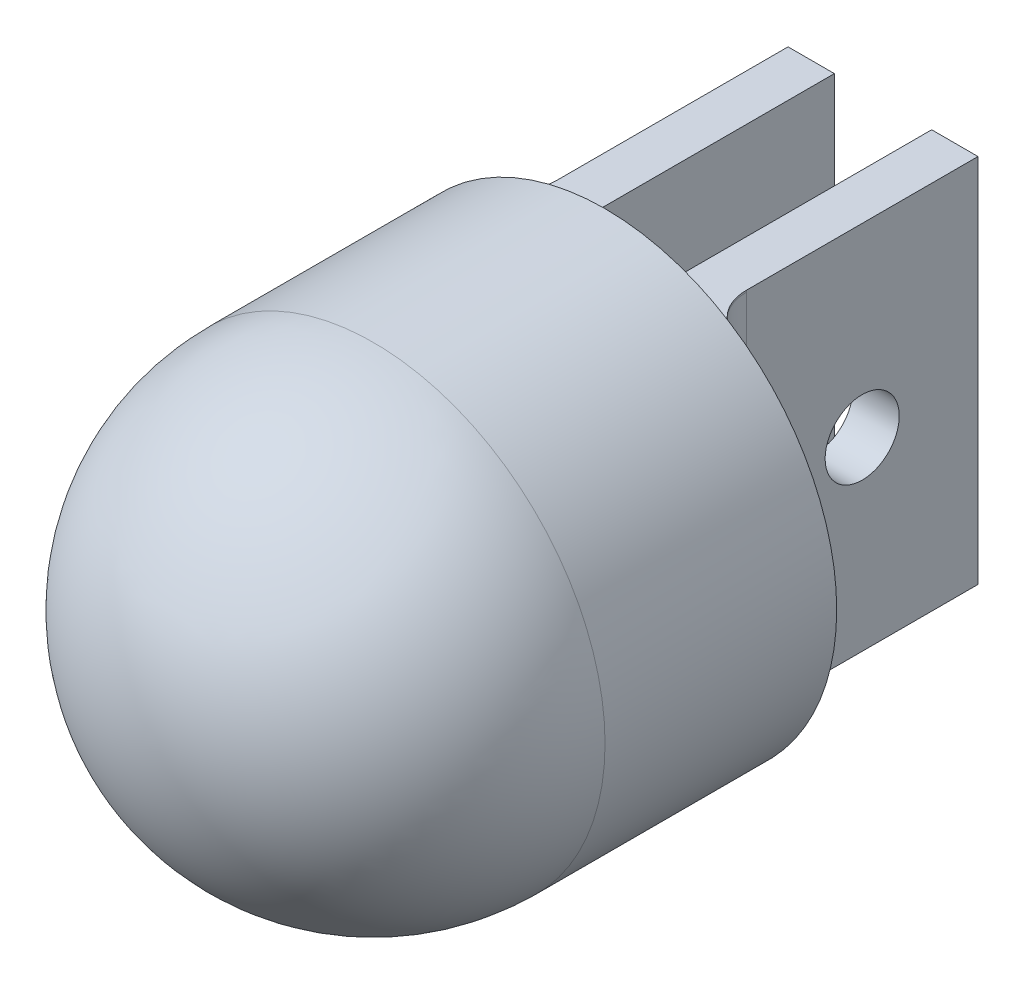
ISO-10303-21;
HEADER;
FILE_DESCRIPTION(('STEP AP214'),'2;1');
FILE_NAME('part.step','',(''),(''),'','','');
FILE_SCHEMA(('AUTOMOTIVE_DESIGN { 1 0 10303 214 1 1 1 1 }'));
ENDSEC;
DATA;
#1=APPLICATION_CONTEXT('core data for automotive mechanical design processes');
#2=APPLICATION_PROTOCOL_DEFINITION('international standard','automotive_design',2000,#1);
#3=PRODUCT_CONTEXT('',#1,'mechanical');
#4=PRODUCT('Part','Part','',(#3));
#5=PRODUCT_RELATED_PRODUCT_CATEGORY('part','',(#4));
#6=PRODUCT_DEFINITION_FORMATION('','',#4);
#7=PRODUCT_DEFINITION_CONTEXT('part definition',#1,'design');
#8=PRODUCT_DEFINITION('design','',#6,#7);
#9=PRODUCT_DEFINITION_SHAPE('','',#8);
#10=(LENGTH_UNIT() NAMED_UNIT(*) SI_UNIT(.MILLI.,.METRE.));
#11=(NAMED_UNIT(*) PLANE_ANGLE_UNIT() SI_UNIT($,.RADIAN.));
#12=(NAMED_UNIT(*) SI_UNIT($,.STERADIAN.) SOLID_ANGLE_UNIT());
#13=UNCERTAINTY_MEASURE_WITH_UNIT(LENGTH_MEASURE(1.E-05),#10,'distance_accuracy_value','');
#14=(GEOMETRIC_REPRESENTATION_CONTEXT(3) GLOBAL_UNCERTAINTY_ASSIGNED_CONTEXT((#13)) GLOBAL_UNIT_ASSIGNED_CONTEXT((#10,
#11,#12)) REPRESENTATION_CONTEXT('',''));
#15=CARTESIAN_POINT('',(0.,0.,0.));
#16=DIRECTION('',(0.,0.,1.));
#17=DIRECTION('',(1.,0.,0.));
#18=AXIS2_PLACEMENT_3D('',#15,#16,#17);
#19=CARTESIAN_POINT('',(0.,0.,-10.));
#20=DIRECTION('',(0.,0.,1.));
#21=DIRECTION('',(1.,0.,0.));
#22=AXIS2_PLACEMENT_3D('',#19,#20,#21);
#23=PLANE('',#22);
#24=DIRECTION('',(-1.,0.,0.));
#25=VECTOR('',#24,1.);
#26=CARTESIAN_POINT('',(2.05,-4.,-10.));
#27=LINE('',#26,#25);
#28=CARTESIAN_POINT('',(2.99999999999999,-4.00000000000001,-10.));
#29=VERTEX_POINT('',#28);
#30=CARTESIAN_POINT('',(1.05,-4.,-10.));
#31=VERTEX_POINT('',#30);
#32=EDGE_CURVE('E174',#29,#31,#27,.T.);
#33=ORIENTED_EDGE('',*,*,#32,.F.);
#34=CARTESIAN_POINT('',(0.,0.,-10.));
#35=DIRECTION('',(0.,0.,1.));
#36=DIRECTION('',(1.,0.,0.));
#37=AXIS2_PLACEMENT_3D('',#34,#35,#36);
#38=CIRCLE('',#37,5.);
#39=CARTESIAN_POINT('',(-3.,-4.,-10.));
#40=VERTEX_POINT('',#39);
#41=EDGE_CURVE('E448',#40,#29,#38,.T.);
#42=ORIENTED_EDGE('',*,*,#41,.F.);
#43=DIRECTION('',(-1.,0.,0.));
#44=VECTOR('',#43,1.);
#45=CARTESIAN_POINT('',(-1.05,-4.,-10.));
#46=LINE('',#45,#44);
#47=CARTESIAN_POINT('',(-1.05,-4.,-10.));
#48=VERTEX_POINT('',#47);
#49=EDGE_CURVE('E452',#48,#40,#46,.T.);
#50=ORIENTED_EDGE('',*,*,#49,.F.);
#51=DIRECTION('',(0.,-1.,0.));
#52=VECTOR('',#51,1.);
#53=CARTESIAN_POINT('',(-1.05,4.,-10.));
#54=LINE('',#53,#52);
#55=CARTESIAN_POINT('',(-1.05,4.,-10.));
#56=VERTEX_POINT('',#55);
#57=EDGE_CURVE('E173',#56,#48,#54,.T.);
#58=ORIENTED_EDGE('',*,*,#57,.F.);
#59=DIRECTION('',(1.,0.,0.));
#60=VECTOR('',#59,1.);
#61=CARTESIAN_POINT('',(-1.05,4.,-10.));
#62=LINE('',#61,#60);
#63=CARTESIAN_POINT('',(-3.,4.,-10.));
#64=VERTEX_POINT('',#63);
#65=EDGE_CURVE('E170',#64,#56,#62,.T.);
#66=ORIENTED_EDGE('',*,*,#65,.F.);
#67=CARTESIAN_POINT('',(3.,4.,-10.));
#68=VERTEX_POINT('',#67);
#69=EDGE_CURVE('E216',#68,#64,#38,.T.);
#70=ORIENTED_EDGE('',*,*,#69,.F.);
#71=DIRECTION('',(1.,0.,0.));
#72=VECTOR('',#71,1.);
#73=CARTESIAN_POINT('',(2.05,4.,-10.));
#74=LINE('',#73,#72);
#75=CARTESIAN_POINT('',(1.05,4.,-10.));
#76=VERTEX_POINT('',#75);
#77=EDGE_CURVE('E187',#76,#68,#74,.T.);
#78=ORIENTED_EDGE('',*,*,#77,.F.);
#79=DIRECTION('',(0.,1.,0.));
#80=VECTOR('',#79,1.);
#81=CARTESIAN_POINT('',(1.05,4.,-10.));
#82=LINE('',#81,#80);
#83=EDGE_CURVE('E177',#31,#76,#82,.T.);
#84=ORIENTED_EDGE('',*,*,#83,.F.);
#85=EDGE_LOOP('',(#33,#42,#50,#58,#66,#70,#78,#84));
#86=FACE_BOUND('',#85,.T.);
#87=ADVANCED_FACE('F42',(#86),#23,.F.);
#88=CARTESIAN_POINT('',(3.05,-3.96200706713151,-10.));
#89=VERTEX_POINT('',#88);
#90=CARTESIAN_POINT('',(3.05,3.96200706713151,-10.));
#91=VERTEX_POINT('',#90);
#92=EDGE_CURVE('E211',#89,#91,#38,.T.);
#93=ORIENTED_EDGE('',*,*,#92,.F.);
#94=DIRECTION('',(0.,-1.,0.));
#95=VECTOR('',#94,1.);
#96=CARTESIAN_POINT('',(3.05,4.,-10.));
#97=LINE('',#96,#95);
#98=EDGE_CURVE('E373',#89,#91,#97,.F.);
#99=ORIENTED_EDGE('',*,*,#98,.T.);
#100=EDGE_LOOP('',(#93,#99));
#101=FACE_BOUND('',#100,.T.);
#102=ADVANCED_FACE('F341',(#101),#23,.F.);
#103=CARTESIAN_POINT('',(-3.05,3.96200706713151,-10.));
#104=VERTEX_POINT('',#103);
#105=CARTESIAN_POINT('',(-3.05,-3.96200706713151,-10.));
#106=VERTEX_POINT('',#105);
#107=EDGE_CURVE('E357',#104,#106,#38,.T.);
#108=ORIENTED_EDGE('',*,*,#107,.F.);
#109=DIRECTION('',(0.,1.,0.));
#110=VECTOR('',#109,1.);
#111=CARTESIAN_POINT('',(-3.05,-4.,-10.));
#112=LINE('',#111,#110);
#113=EDGE_CURVE('E360',#104,#106,#112,.F.);
#114=ORIENTED_EDGE('',*,*,#113,.T.);
#115=EDGE_LOOP('',(#108,#114));
#116=FACE_BOUND('',#115,.T.);
#117=ADVANCED_FACE('F343',(#116),#23,.F.);
#118=CARTESIAN_POINT('',(0.,0.,-5.));
#119=DIRECTION('',(0.,0.,1.));
#120=DIRECTION('',(-1.,0.,0.));
#121=AXIS2_PLACEMENT_3D('',#118,#119,#120);
#122=SPHERICAL_SURFACE('',#121,5.);
#123=CARTESIAN_POINT('',(0.,0.,-5.));
#124=DIRECTION('',(0.,0.,1.));
#125=DIRECTION('',(1.,0.,0.));
#126=AXIS2_PLACEMENT_3D('',#123,#124,#125);
#127=CIRCLE('',#126,5.);
#128=CARTESIAN_POINT('',(5.,0.,-5.));
#129=VERTEX_POINT('',#128);
#130=EDGE_CURVE('E208',#129,#129,#127,.T.);
#131=ORIENTED_EDGE('',*,*,#130,.T.);
#132=EDGE_LOOP('',(#131));
#133=FACE_BOUND('',#132,.T.);
#134=ADVANCED_FACE('F234',(#133),#122,.T.);
#135=CARTESIAN_POINT('',(0.,0.,0.));
#136=DIRECTION('',(0.,0.,1.));
#137=DIRECTION('',(1.,0.,0.));
#138=AXIS2_PLACEMENT_3D('',#135,#136,#137);
#139=CYLINDRICAL_SURFACE('',#138,5.);
#140=ORIENTED_EDGE('',*,*,#130,.F.);
#141=EDGE_LOOP('',(#140));
#142=FACE_BOUND('',#141,.T.);
#143=EDGE_CURVE('E212',#91,#68,#38,.T.);
#144=ORIENTED_EDGE('',*,*,#143,.T.);
#145=ORIENTED_EDGE('',*,*,#69,.T.);
#146=EDGE_CURVE('E363',#64,#104,#38,.T.);
#147=ORIENTED_EDGE('',*,*,#146,.T.);
#148=ORIENTED_EDGE('',*,*,#107,.T.);
#149=EDGE_CURVE('E364',#106,#40,#38,.T.);
#150=ORIENTED_EDGE('',*,*,#149,.T.);
#151=ORIENTED_EDGE('',*,*,#41,.T.);
#152=EDGE_CURVE('E450',#29,#89,#38,.T.);
#153=ORIENTED_EDGE('',*,*,#152,.T.);
#154=ORIENTED_EDGE('',*,*,#92,.T.);
#155=EDGE_LOOP('',(#144,#145,#147,#148,#150,#151,#153,#154));
#156=FACE_BOUND('',#155,.T.);
#157=ADVANCED_FACE('F354',(#142,#156),#139,.T.);
#158=CARTESIAN_POINT('',(2.05,4.,-16.));
#159=DIRECTION('',(-1.,0.,0.));
#160=DIRECTION('',(0.,0.,1.));
#161=AXIS2_PLACEMENT_3D('',#158,#159,#160);
#162=PLANE('',#161);
#163=CARTESIAN_POINT('',(2.05,0.,-13.5));
#164=DIRECTION('',(-1.,0.,0.));
#165=DIRECTION('',(0.,0.,1.));
#166=AXIS2_PLACEMENT_3D('',#163,#164,#165);
#167=CIRCLE('',#166,0.799999999999999);
#168=CARTESIAN_POINT('',(2.05,0.,-12.7));
#169=VERTEX_POINT('',#168);
#170=EDGE_CURVE('E483',#169,#169,#167,.T.);
#171=ORIENTED_EDGE('',*,*,#170,.T.);
#172=EDGE_LOOP('',(#171));
#173=FACE_BOUND('',#172,.T.);
#174=DIRECTION('',(0.,0.,1.));
#175=VECTOR('',#174,1.);
#176=CARTESIAN_POINT('',(2.05,4.,-16.));
#177=LINE('',#176,#175);
#178=CARTESIAN_POINT('',(2.05,4.,-16.));
#179=VERTEX_POINT('',#178);
#180=CARTESIAN_POINT('',(2.05,4.,-10.999545112595));
#181=VERTEX_POINT('',#180);
#182=EDGE_CURVE('E192',#179,#181,#177,.T.);
#183=ORIENTED_EDGE('',*,*,#182,.T.);
#184=CARTESIAN_POINT('',(2.05,4.42250597429172,-10.9281329094554));
#185=CARTESIAN_POINT('',(2.05,4.1695292771691,-10.161928069819));
#186=CARTESIAN_POINT('',(2.83866216781424,4.11606573040569,-10.));
#187=CARTESIAN_POINT('',(2.05,4.35624131546451,-10.9500035749279));
#188=CARTESIAN_POINT('',(2.05,4.13510930000068,-10.1473957277652));
#189=CARTESIAN_POINT('',(2.86746645626384,4.09620372175779,-10.));
#190=CARTESIAN_POINT('',(2.05,4.28840922934222,-10.9666742010723));
#191=CARTESIAN_POINT('',(2.05,4.10170190449175,-10.1284330282984));
#192=CARTESIAN_POINT('',(2.89766080548082,4.07493054369303,-10.));
#193=CARTESIAN_POINT('',(2.05,4.15233050214103,-10.989960314844));
#194=CARTESIAN_POINT('',(2.05,4.0387589323051,-10.0826194672207));
#195=CARTESIAN_POINT('',(2.95971189957112,4.03007936736662,-10.));
#196=CARTESIAN_POINT('',(2.05,4.08411540267534,-10.996758225122));
#197=CARTESIAN_POINT('',(2.05,4.00913661542119,-10.0556106323797));
#198=CARTESIAN_POINT('',(2.99152693351777,4.00655198096036,-10.));
#199=CARTESIAN_POINT('',(2.05,3.93532808559211,-11.0018292021244));
#200=CARTESIAN_POINT('',(2.05,3.95029853802941,-9.98805060346541));
#201=CARTESIAN_POINT('',(3.06258728042936,3.95257796356009,-10.));
#202=CARTESIAN_POINT('',(2.05,3.85470161900439,-10.9983842541537));
#203=CARTESIAN_POINT('',(2.05,3.92240810942774,-9.94562620728129));
#204=CARTESIAN_POINT('',(3.10215236715878,3.92164322161213,-10.));
#205=CARTESIAN_POINT('',(2.05,3.69297941208206,-10.9796668342804));
#206=CARTESIAN_POINT('',(2.05,3.87761345096821,-9.84971674900551));
#207=CARTESIAN_POINT('',(3.18358541869401,3.85585662313962,-10.));
#208=CARTESIAN_POINT('',(2.05,3.61191382353022,-10.96413038173));
#209=CARTESIAN_POINT('',(2.05,3.86144882882569,-9.79532734646334));
#210=CARTESIAN_POINT('',(3.22548515072285,3.82093237765422,-10.));
#211=CARTESIAN_POINT('',(2.05,3.53246011439569,-10.9429224926582));
#212=CARTESIAN_POINT('',(2.05,3.85463371528915,-9.73770590149489));
#213=CARTESIAN_POINT('',(3.26763233299994,3.78451832289571,-10.));
#214=(BOUNDED_SURFACE() B_SPLINE_SURFACE(3,2,((#184,#185,#186),(#187,#188,#189),(#190,#191,
#192),(#193,#194,#195),(#196,#197,#198),(#199,#200,#201),(#202,#203,#204),(#205,#206,#207),
(#208,#209,#210),(#211,#212,#213)),.UNSPECIFIED.,.F.,.F.,.F.) B_SPLINE_SURFACE_WITH_KNOTS((4,2,
2,2,4),(3,3),(0.,0.208923156285035,0.413934551436384,0.655160661265064,0.901806203029568),(0.,
1.),.UNSPECIFIED.) GEOMETRIC_REPRESENTATION_ITEM() RATIONAL_B_SPLINE_SURFACE(((1.,
0.778247336065391,1.),(1.,0.768992455791532,1.),(1.,0.759129936276205,1.),(1.,0.738410482913842,
1.),(1.,0.727575625406003,1.),(1.,0.702770444011949,1.),(1.,0.688584342277388,1.),(1.,
0.658361191209766,1.),(1.,0.642289718281444,1.),(1.,0.625446907019317,1.))) REPRESENTATION_ITEM('') SURFACE());
#215=CARTESIAN_POINT('',(2.05,4.42250597429172,-10.9281329094554));
#216=CARTESIAN_POINT('',(2.05,4.35624131546451,-10.9500035749279));
#217=CARTESIAN_POINT('',(2.05,4.28840922934222,-10.9666742010723));
#218=CARTESIAN_POINT('',(2.05,4.15233050214103,-10.989960314844));
#219=CARTESIAN_POINT('',(2.05,4.08411540267534,-10.996758225122));
#220=CARTESIAN_POINT('',(2.05,3.93532808559211,-11.0018292021244));
#221=CARTESIAN_POINT('',(2.05,3.85470161900439,-10.9983842541537));
#222=CARTESIAN_POINT('',(2.05,3.69297941208207,-10.9796668342804));
#223=CARTESIAN_POINT('',(2.05,3.61191382353022,-10.96413038173));
#224=CARTESIAN_POINT('',(2.05,3.53246011439569,-10.9429224926582));
#225=B_SPLINE_CURVE_WITH_KNOTS('',3,(#215,#216,#217,#218,#219,#220,#221,#222,#223,#224),
.UNSPECIFIED.,.F.,.F.,(4,2,2,2,4),(0.,0.208923156285035,0.413934551436384,0.655160661265064,
0.901806203029568),.UNSPECIFIED.);
#226=CARTESIAN_POINT('',(2.05,3.96200706713151,-11.));
#227=VERTEX_POINT('',#226);
#228=EDGE_CURVE('E374',#181,#227,#225,.T.);
#229=ORIENTED_EDGE('',*,*,#228,.T.);
#230=DIRECTION('',(0.,-1.,0.));
#231=VECTOR('',#230,1.);
#232=CARTESIAN_POINT('',(2.05,-4.,-11.));
#233=LINE('',#232,#231);
#234=CARTESIAN_POINT('',(2.05,-3.96200706713151,-11.));
#235=VERTEX_POINT('',#234);
#236=EDGE_CURVE('E224',#227,#235,#233,.T.);
#237=ORIENTED_EDGE('',*,*,#236,.T.);
#238=CARTESIAN_POINT('',(2.05,-3.57118067229306,-10.952787992147));
#239=CARTESIAN_POINT('',(2.05,-3.85878328544616,-9.76596696606793));
#240=CARTESIAN_POINT('',(3.24719319829145,-3.80207000632152,-10.));
#241=CARTESIAN_POINT('',(2.05,-3.61592998308543,-10.9636277397331));
#242=CARTESIAN_POINT('',(2.05,-3.86431054512773,-9.79764368046994));
#243=CARTESIAN_POINT('',(3.22366166589383,-3.82216984782215,-10.));
#244=CARTESIAN_POINT('',(2.05,-3.66112229593428,-10.9726615222754));
#245=CARTESIAN_POINT('',(2.05,-3.87264491860033,-9.8282526053503));
#246=CARTESIAN_POINT('',(3.20022942702058,-3.84180201558553,-10.));
#247=CARTESIAN_POINT('',(2.05,-3.75177426021552,-10.9869412864299));
#248=CARTESIAN_POINT('',(2.05,-3.89375220029164,-9.88574235766504));
#249=CARTESIAN_POINT('',(3.15390153860201,-3.87992187131483,-10.));
#250=CARTESIAN_POINT('',(2.05,-3.79722979172892,-10.9922134785399));
#251=CARTESIAN_POINT('',(2.05,-3.90639158833161,-9.91277377177276));
#252=CARTESIAN_POINT('',(3.13100327325273,-3.89841664154533,-10.));
#253=CARTESIAN_POINT('',(2.05,-3.88845098104488,-10.9989518083573));
#254=CARTESIAN_POINT('',(2.05,-3.93514328741929,-9.96319471472738));
#255=CARTESIAN_POINT('',(3.08573373965971,-3.93434665842462,-10.));
#256=CARTESIAN_POINT('',(2.05,-3.93421678479078,-11.0004160093568));
#257=CARTESIAN_POINT('',(2.05,-3.95119627362663,-9.98670401913377));
#258=CARTESIAN_POINT('',(3.06336274530997,-3.95178136153302,-10.));
#259=CARTESIAN_POINT('',(2.05,-4.02602588822754,-10.9993776133338));
#260=CARTESIAN_POINT('',(2.05,-3.98605627940352,-10.0301432062995));
#261=CARTESIAN_POINT('',(3.01916100159306,-3.98565556382531,-10.));
#262=CARTESIAN_POINT('',(2.05,-4.07206885405725,-10.9968468100896));
#263=CARTESIAN_POINT('',(2.05,-4.00485179375893,-10.0501613444326));
#264=CARTESIAN_POINT('',(2.99733520883515,-4.00208712810467,-10.));
#265=CARTESIAN_POINT('',(2.05,-4.11791738109246,-10.9922288690447));
#266=CARTESIAN_POINT('',(2.05,-4.02482443544518,-10.0684149228515));
#267=CARTESIAN_POINT('',(2.97594296380415,-4.0179302477998,-10.));
#268=(BOUNDED_SURFACE() B_SPLINE_SURFACE(3,2,((#238,#239,#240),(#241,#242,#243),(#244,#245,
#246),(#247,#248,#249),(#250,#251,#252),(#253,#254,#255),(#256,#257,#258),(#259,#260,#261),
(#262,#263,#264),(#265,#266,#267)),.UNSPECIFIED.,.F.,.F.,.F.) B_SPLINE_SURFACE_WITH_KNOTS((4,2,
2,2,4),(3,3),(0.,0.138100472242239,0.27522901489359,0.41242728619015,0.550598569215037),(0.,1.),
.UNSPECIFIED.) GEOMETRIC_REPRESENTATION_ITEM() RATIONAL_B_SPLINE_SURFACE(((1.,0.633564046371221,
1.),(1.,0.642849074268439,1.),(1.,0.651891516682947,1.),(1.,0.669421858974354,1.),(1.,
0.677913213751697,1.),(1.,0.694407079445453,1.),(1.,0.702409339593556,1.),(1.,0.717969572526443,
1.),(1.,0.7255239919334,1.),(1.,0.732822296397924,1.))) REPRESENTATION_ITEM('') SURFACE());
#269=CARTESIAN_POINT('',(2.05,-3.57118067229306,-10.952787992147));
#270=CARTESIAN_POINT('',(2.05,-3.61592998308543,-10.9636277397331));
#271=CARTESIAN_POINT('',(2.05,-3.66112229593428,-10.9726615222754));
#272=CARTESIAN_POINT('',(2.05,-3.75177426021552,-10.9869412864299));
#273=CARTESIAN_POINT('',(2.05,-3.79722979172892,-10.9922134785399));
#274=CARTESIAN_POINT('',(2.05,-3.88845098104488,-10.9989518083573));
#275=CARTESIAN_POINT('',(2.05,-3.93421678479078,-11.0004160093568));
#276=CARTESIAN_POINT('',(2.05,-4.02602588822754,-10.9993776133338));
#277=CARTESIAN_POINT('',(2.05,-4.07206885405725,-10.9968468100896));
#278=CARTESIAN_POINT('',(2.05,-4.11791738109246,-10.9922288690447));
#279=B_SPLINE_CURVE_WITH_KNOTS('',3,(#269,#270,#271,#272,#273,#274,#275,#276,#277,#278),
.UNSPECIFIED.,.F.,.F.,(4,2,2,2,4),(0.,0.138100472242239,0.27522901489359,0.41242728619015,
0.550598569215037),.UNSPECIFIED.);
#280=CARTESIAN_POINT('',(2.05,-4.,-10.999545112595));
#281=VERTEX_POINT('',#280);
#282=EDGE_CURVE('E215',#235,#281,#279,.T.);
#283=ORIENTED_EDGE('',*,*,#282,.T.);
#284=DIRECTION('',(0.,0.,1.));
#285=VECTOR('',#284,1.);
#286=CARTESIAN_POINT('',(2.05,-4.,-16.));
#287=LINE('',#286,#285);
#288=CARTESIAN_POINT('',(2.05,-4.,-16.));
#289=VERTEX_POINT('',#288);
#290=EDGE_CURVE('E205',#289,#281,#287,.T.);
#291=ORIENTED_EDGE('',*,*,#290,.F.);
#292=DIRECTION('',(0.,-1.,0.));
#293=VECTOR('',#292,1.);
#294=CARTESIAN_POINT('',(2.05,4.,-16.));
#295=LINE('',#294,#293);
#296=EDGE_CURVE('E183',#179,#289,#295,.T.);
#297=ORIENTED_EDGE('',*,*,#296,.F.);
#298=EDGE_LOOP('',(#183,#229,#237,#283,#291,#297));
#299=FACE_BOUND('',#298,.T.);
#300=ADVANCED_FACE('F226',(#173,#299),#162,.F.);
#301=CARTESIAN_POINT('',(2.05,-4.,-16.));
#302=DIRECTION('',(0.,1.,0.));
#303=DIRECTION('',(0.,0.,1.));
#304=AXIS2_PLACEMENT_3D('',#301,#302,#303);
#305=PLANE('',#304);
#306=ORIENTED_EDGE('',*,*,#32,.T.);
#307=DIRECTION('',(0.,0.,1.));
#308=VECTOR('',#307,1.);
#309=CARTESIAN_POINT('',(1.05,-4.,-16.));
#310=LINE('',#309,#308);
#311=CARTESIAN_POINT('',(1.05,-4.,-16.));
#312=VERTEX_POINT('',#311);
#313=EDGE_CURVE('E202',#312,#31,#310,.T.);
#314=ORIENTED_EDGE('',*,*,#313,.F.);
#315=DIRECTION('',(-1.,0.,0.));
#316=VECTOR('',#315,1.);
#317=CARTESIAN_POINT('',(2.05,-4.,-16.));
#318=LINE('',#317,#316);
#319=EDGE_CURVE('E186',#289,#312,#318,.T.);
#320=ORIENTED_EDGE('',*,*,#319,.F.);
#321=ORIENTED_EDGE('',*,*,#290,.T.);
#322=CARTESIAN_POINT('',(2.05,-4.,-10.999545112595));
#323=CARTESIAN_POINT('',(2.05000019085502,-4.,-10.9713852833981));
#324=CARTESIAN_POINT('',(2.05118951906178,-4.,-10.9432389565056));
#325=CARTESIAN_POINT('',(2.05593401033734,-4.,-10.8871478784937));
#326=CARTESIAN_POINT('',(2.05948905385533,-4.,-10.8592031172604));
#327=CARTESIAN_POINT('',(2.07366875259094,-4.,-10.7760198262838));
#328=CARTESIAN_POINT('',(2.08780807053174,-4.,-10.721338747749));
#329=CARTESIAN_POINT('',(2.12506445755386,-4.,-10.6151279948823));
#330=CARTESIAN_POINT('',(2.14818578138739,-4.,-10.5635998274861));
#331=CARTESIAN_POINT('',(2.20274584670661,-4.,-10.4651580782229));
#332=CARTESIAN_POINT('',(2.2341829069639,-4.,-10.4182435662204));
#333=CARTESIAN_POINT('',(2.30449043802347,-4.,-10.3303455125965));
#334=CARTESIAN_POINT('',(2.34336271974171,-4.,-10.2893634201509));
#335=CARTESIAN_POINT('',(2.42745059971115,-4.,-10.214493734117));
#336=CARTESIAN_POINT('',(2.47266816805701,-4.,-10.180608352102));
#337=CARTESIAN_POINT('',(2.56816184655872,-4.,-10.1209036904907));
#338=CARTESIAN_POINT('',(2.61843973912312,-4.,-10.0950872662779));
#339=CARTESIAN_POINT('',(2.72259916311509,-4.,-10.0522996354013));
#340=CARTESIAN_POINT('',(2.77647701639413,-4.,-10.0353195518174));
#341=CARTESIAN_POINT('',(2.85909146664722,-4.,-10.0167643422364));
#342=CARTESIAN_POINT('',(2.88709110926637,-4.,-10.0117233400259));
#343=CARTESIAN_POINT('',(2.94336936353401,-4.,-10.0040540267018));
#344=CARTESIAN_POINT('',(2.97164740643133,-4.,-10.0014215418484));
#345=CARTESIAN_POINT('',(3.,-4.,-10.));
#346=B_SPLINE_CURVE_WITH_KNOTS('',3,(#322,#323,#324,#325,#326,#327,#328,#329,#330,#331,#332,
#333,#334,#335,#336,#337,#338,#339,#340,#341,#342,#343,#344,#345),.UNSPECIFIED.,.F.,.F.,(4,2,2,
2,2,2,2,2,2,2,2,4),(0.,0.0844275701659049,0.168850874130653,0.337420430752119,0.506069935882966,
0.67468537043955,0.843341925237095,1.01205096112789,1.18081963111547,1.34941842849462,
1.43467783735338,1.51978921808037),.UNSPECIFIED.);
#347=EDGE_CURVE('E394',#281,#29,#346,.T.);
#348=ORIENTED_EDGE('',*,*,#347,.T.);
#349=EDGE_LOOP('',(#306,#314,#320,#321,#348));
#350=FACE_BOUND('',#349,.T.);
#351=ADVANCED_FACE('F443',(#350),#305,.F.);
#352=CARTESIAN_POINT('',(1.05,4.,-16.));
#353=DIRECTION('',(1.,0.,0.));
#354=DIRECTION('',(0.,0.,-1.));
#355=AXIS2_PLACEMENT_3D('',#352,#353,#354);
#356=PLANE('',#355);
#357=CARTESIAN_POINT('',(1.05,0.,-13.5));
#358=DIRECTION('',(1.,0.,0.));
#359=DIRECTION('',(0.,0.,-1.));
#360=AXIS2_PLACEMENT_3D('',#357,#358,#359);
#361=CIRCLE('',#360,0.799999999999999);
#362=CARTESIAN_POINT('',(1.05,0.,-14.3));
#363=VERTEX_POINT('',#362);
#364=EDGE_CURVE('E484',#363,#363,#361,.T.);
#365=ORIENTED_EDGE('',*,*,#364,.T.);
#366=EDGE_LOOP('',(#365));
#367=FACE_BOUND('',#366,.T.);
#368=ORIENTED_EDGE('',*,*,#83,.T.);
#369=DIRECTION('',(0.,0.,1.));
#370=VECTOR('',#369,1.);
#371=CARTESIAN_POINT('',(1.05,4.,-16.));
#372=LINE('',#371,#370);
#373=CARTESIAN_POINT('',(1.05,4.,-16.));
#374=VERTEX_POINT('',#373);
#375=EDGE_CURVE('E199',#374,#76,#372,.T.);
#376=ORIENTED_EDGE('',*,*,#375,.F.);
#377=DIRECTION('',(0.,1.,0.));
#378=VECTOR('',#377,1.);
#379=CARTESIAN_POINT('',(1.05,4.,-16.));
#380=LINE('',#379,#378);
#381=EDGE_CURVE('E189',#312,#374,#380,.T.);
#382=ORIENTED_EDGE('',*,*,#381,.F.);
#383=ORIENTED_EDGE('',*,*,#313,.T.);
#384=EDGE_LOOP('',(#368,#376,#382,#383));
#385=FACE_BOUND('',#384,.T.);
#386=ADVANCED_FACE('F455',(#367,#385),#356,.F.);
#387=CARTESIAN_POINT('',(2.05,4.,-16.));
#388=DIRECTION('',(0.,-1.,0.));
#389=DIRECTION('',(0.,0.,-1.));
#390=AXIS2_PLACEMENT_3D('',#387,#388,#389);
#391=PLANE('',#390);
#392=ORIENTED_EDGE('',*,*,#77,.T.);
#393=CARTESIAN_POINT('',(2.99999999999997,4.00000000000002,-10.));
#394=CARTESIAN_POINT('',(2.97192135723896,4.00000000000001,-10.001408157899));
#395=CARTESIAN_POINT('',(2.94391579511719,4.,-10.0040032384905));
#396=CARTESIAN_POINT('',(2.8882249172033,4.,-10.0115449208855));
#397=CARTESIAN_POINT('',(2.86053958137222,4.,-10.0164913747214));
#398=CARTESIAN_POINT('',(2.77831266456901,4.,-10.0348041031243));
#399=CARTESIAN_POINT('',(2.72450389324998,4.,-10.0516486782176));
#400=CARTESIAN_POINT('',(2.62047961929612,4.,-10.0941241557584));
#401=CARTESIAN_POINT('',(2.5702656655272,4.,-10.1197588182958));
#402=CARTESIAN_POINT('',(2.47484774530891,4.,-10.1790807843667));
#403=CARTESIAN_POINT('',(2.42964289131534,4.,-10.2127666579854));
#404=CARTESIAN_POINT('',(2.34545809990267,4.,-10.287285163819));
#405=CARTESIAN_POINT('',(2.30648688062046,4.,-10.3281276406897));
#406=CARTESIAN_POINT('',(2.23593679879296,4.,-10.4157865026216));
#407=CARTESIAN_POINT('',(2.20436014486308,4.,-10.4626046660715));
#408=CARTESIAN_POINT('',(2.14948316924665,4.,-10.5609187766541));
#409=CARTESIAN_POINT('',(2.12619136428311,4.,-10.6124194694955));
#410=CARTESIAN_POINT('',(2.08860868722374,4.,-10.7185791265031));
#411=CARTESIAN_POINT('',(2.07430907593965,4.,-10.7732349677019));
#412=CARTESIAN_POINT('',(2.05980571153227,4.,-10.8568856199277));
#413=CARTESIAN_POINT('',(2.05612828984577,4.,-10.885318650426));
#414=CARTESIAN_POINT('',(2.05122763814633,4.,-10.9423451847973));
#415=CARTESIAN_POINT('',(2.05000011300556,4.,-10.9709383195347));
#416=CARTESIAN_POINT('',(2.05,4.,-10.999545112595));
#417=B_SPLINE_CURVE_WITH_KNOTS('',3,(#393,#394,#395,#396,#397,#398,#399,#400,#401,#402,#403,
#404,#405,#406,#407,#408,#409,#410,#411,#412,#413,#414,#415,#416),.UNSPECIFIED.,.F.,.F.,(4,2,2,
2,2,2,2,2,2,2,2,4),(0.,0.0842897996626398,0.16857429582964,0.336857756251151,0.505213292396123,
0.673538950373879,0.842098002188593,1.01070733534143,1.17948949927122,1.34810737536644,
1.43402509989669,1.51979206176674),.UNSPECIFIED.);
#418=EDGE_CURVE('E312',#68,#181,#417,.T.);
#419=ORIENTED_EDGE('',*,*,#418,.T.);
#420=ORIENTED_EDGE('',*,*,#182,.F.);
#421=DIRECTION('',(1.,0.,0.));
#422=VECTOR('',#421,1.);
#423=CARTESIAN_POINT('',(2.05,4.,-16.));
#424=LINE('',#423,#422);
#425=EDGE_CURVE('E191',#374,#179,#424,.T.);
#426=ORIENTED_EDGE('',*,*,#425,.F.);
#427=ORIENTED_EDGE('',*,*,#375,.T.);
#428=EDGE_LOOP('',(#392,#419,#420,#426,#427));
#429=FACE_BOUND('',#428,.T.);
#430=ADVANCED_FACE('F438',(#429),#391,.F.);
#431=CARTESIAN_POINT('',(0.,0.,-16.));
#432=DIRECTION('',(0.,0.,-1.));
#433=DIRECTION('',(-1.,0.,0.));
#434=AXIS2_PLACEMENT_3D('',#431,#432,#433);
#435=PLANE('',#434);
#436=ORIENTED_EDGE('',*,*,#296,.T.);
#437=ORIENTED_EDGE('',*,*,#319,.T.);
#438=ORIENTED_EDGE('',*,*,#381,.T.);
#439=ORIENTED_EDGE('',*,*,#425,.T.);
#440=EDGE_LOOP('',(#436,#437,#438,#439));
#441=FACE_BOUND('',#440,.T.);
#442=ADVANCED_FACE('F458',(#441),#435,.T.);
#443=CARTESIAN_POINT('',(-1.05,4.,-16.));
#444=DIRECTION('',(-1.,0.,0.));
#445=DIRECTION('',(0.,0.,1.));
#446=AXIS2_PLACEMENT_3D('',#443,#444,#445);
#447=PLANE('',#446);
#448=CARTESIAN_POINT('',(-1.05,0.,-13.5));
#449=DIRECTION('',(-1.,0.,0.));
#450=DIRECTION('',(0.,0.,1.));
#451=AXIS2_PLACEMENT_3D('',#448,#449,#450);
#452=CIRCLE('',#451,0.799999999999999);
#453=CARTESIAN_POINT('',(-1.05,0.,-12.7));
#454=VERTEX_POINT('',#453);
#455=EDGE_CURVE('E425',#454,#454,#452,.T.);
#456=ORIENTED_EDGE('',*,*,#455,.T.);
#457=EDGE_LOOP('',(#456));
#458=FACE_BOUND('',#457,.T.);
#459=ORIENTED_EDGE('',*,*,#57,.T.);
#460=DIRECTION('',(0.,0.,1.));
#461=VECTOR('',#460,1.);
#462=CARTESIAN_POINT('',(-1.05,-4.,-16.));
#463=LINE('',#462,#461);
#464=CARTESIAN_POINT('',(-1.05,-4.,-16.));
#465=VERTEX_POINT('',#464);
#466=EDGE_CURVE('E154',#465,#48,#463,.T.);
#467=ORIENTED_EDGE('',*,*,#466,.F.);
#468=DIRECTION('',(0.,-1.,0.));
#469=VECTOR('',#468,1.);
#470=CARTESIAN_POINT('',(-1.05,4.,-16.));
#471=LINE('',#470,#469);
#472=CARTESIAN_POINT('',(-1.05,4.,-16.));
#473=VERTEX_POINT('',#472);
#474=EDGE_CURVE('E161',#473,#465,#471,.T.);
#475=ORIENTED_EDGE('',*,*,#474,.F.);
#476=DIRECTION('',(0.,0.,1.));
#477=VECTOR('',#476,1.);
#478=CARTESIAN_POINT('',(-1.05,4.,-16.));
#479=LINE('',#478,#477);
#480=EDGE_CURVE('E492',#473,#56,#479,.T.);
#481=ORIENTED_EDGE('',*,*,#480,.T.);
#482=EDGE_LOOP('',(#459,#467,#475,#481));
#483=FACE_BOUND('',#482,.T.);
#484=ADVANCED_FACE('F172',(#458,#483),#447,.F.);
#485=CARTESIAN_POINT('',(-1.05,-4.,-16.));
#486=DIRECTION('',(0.,1.,0.));
#487=DIRECTION('',(0.,0.,1.));
#488=AXIS2_PLACEMENT_3D('',#485,#486,#487);
#489=PLANE('',#488);
#490=ORIENTED_EDGE('',*,*,#49,.T.);
#491=CARTESIAN_POINT('',(-2.05,-4.42250597429172,-10.9281329094554));
#492=CARTESIAN_POINT('',(-2.05,-4.16952927420441,-10.1619280674092));
#493=CARTESIAN_POINT('',(-2.83866217162405,-4.11606572777824,-10.));
#494=CARTESIAN_POINT('',(-2.05,-4.35624131546451,-10.9500035749279));
#495=CARTESIAN_POINT('',(-2.05,-4.13510929889989,-10.1473957268781));
#496=CARTESIAN_POINT('',(-2.86746645763655,-4.09620372081109,-10.));
#497=CARTESIAN_POINT('',(-2.05,-4.28840922934222,-10.9666742010723));
#498=CARTESIAN_POINT('',(-2.05,-4.10170190418735,-10.1284330280543));
#499=CARTESIAN_POINT('',(-2.89766080584913,-4.07493054343902,-10.));
#500=CARTESIAN_POINT('',(-2.05,-4.15233050214103,-10.989960314844));
#501=CARTESIAN_POINT('',(-2.05,-4.0387589326222,-10.0826194674743));
#502=CARTESIAN_POINT('',(-2.95971189920955,-4.03007936761598,-10.));
#503=CARTESIAN_POINT('',(-2.05,-4.08411540267533,-10.996758225122));
#504=CARTESIAN_POINT('',(-2.05,-4.00913661552112,-10.0556106324598));
#505=CARTESIAN_POINT('',(-2.99152693340711,-4.00655198103668,-10.));
#506=CARTESIAN_POINT('',(-2.05,-3.93532808559211,-11.0018292021244));
#507=CARTESIAN_POINT('',(-2.05,-3.95029853790436,-9.98805060336406));
#508=CARTESIAN_POINT('',(-3.06258728055934,-3.95257796347046,-10.));
#509=CARTESIAN_POINT('',(-2.05,-3.85470161900439,-10.9983842541537));
#510=CARTESIAN_POINT('',(-2.05,-3.92240810936235,-9.94562620722767));
#511=CARTESIAN_POINT('',(-3.10215236722451,-3.92164322156679,-10.));
#512=CARTESIAN_POINT('',(-2.05,-3.69297941208206,-10.9796668342804));
#513=CARTESIAN_POINT('',(-2.05,-3.87761345103961,-9.84971674906601));
#514=CARTESIAN_POINT('',(-3.1835854186268,-3.85585662318598,-10.));
#515=CARTESIAN_POINT('',(-2.05,-3.61191382353022,-10.96413038173));
#516=CARTESIAN_POINT('',(-2.05,-3.86144882897485,-9.79532734659253));
#517=CARTESIAN_POINT('',(-3.22548515058686,-3.82093237774801,-10.));
#518=CARTESIAN_POINT('',(-2.05,-3.53246011439569,-10.9429224926582));
#519=CARTESIAN_POINT('',(-2.05,-3.85463371528927,-9.73770590149518));
#520=CARTESIAN_POINT('',(-3.26763233299976,-3.78451832289587,-10.));
#521=(BOUNDED_SURFACE() B_SPLINE_SURFACE(3,2,((#491,#492,#493),(#494,#495,#496),(#497,#498,
#499),(#500,#501,#502),(#503,#504,#505),(#506,#507,#508),(#509,#510,#511),(#512,#513,#514),
(#515,#516,#517),(#518,#519,#520)),.UNSPECIFIED.,.F.,.F.,.F.) B_SPLINE_SURFACE_WITH_KNOTS((4,2,
2,2,4),(3,3),(0.,0.208923156285035,0.413934551436384,0.655160661265063,0.901806203029568),(0.,
1.),.UNSPECIFIED.) GEOMETRIC_REPRESENTATION_ITEM() RATIONAL_B_SPLINE_SURFACE(((1.,
0.778247334841551,1.),(1.,0.76899245535057,1.),(1.,0.759129936157891,1.),(1.,0.738410483029995,
1.),(1.,0.727575625441554,1.),(1.,0.702770443970198,1.),(1.,0.688584342256274,1.),(1.,
0.65836119123136,1.),(1.,0.642289718325133,1.),(1.,0.625446907019391,1.))) REPRESENTATION_ITEM('') SURFACE());
#522=CARTESIAN_POINT('',(-2.99999999999997,-4.00000000000002,-10.));
#523=CARTESIAN_POINT('',(-2.97192135723896,-4.00000000000001,-10.001408157899));
#524=CARTESIAN_POINT('',(-2.94391579511722,-4.,-10.0040032384905));
#525=CARTESIAN_POINT('',(-2.88822491720337,-4.,-10.0115449208856));
#526=CARTESIAN_POINT('',(-2.86053958137231,-4.,-10.0164913747216));
#527=CARTESIAN_POINT('',(-2.77831266456909,-4.,-10.0348041031245));
#528=CARTESIAN_POINT('',(-2.72450389325001,-4.,-10.0516486782176));
#529=CARTESIAN_POINT('',(-2.6204796192961,-4.,-10.0941241557584));
#530=CARTESIAN_POINT('',(-2.57026566552717,-4.,-10.1197588182958));
#531=CARTESIAN_POINT('',(-2.47484774530889,-4.,-10.1790807843667));
#532=CARTESIAN_POINT('',(-2.42964289131533,-4.,-10.2127666579854));
#533=CARTESIAN_POINT('',(-2.34545809990267,-4.,-10.287285163819));
#534=CARTESIAN_POINT('',(-2.30648688062045,-4.,-10.3281276406897));
#535=CARTESIAN_POINT('',(-2.23593679879296,-4.,-10.4157865026216));
#536=CARTESIAN_POINT('',(-2.20436014486308,-4.,-10.4626046660715));
#537=CARTESIAN_POINT('',(-2.14948316924666,-4.,-10.5609187766541));
#538=CARTESIAN_POINT('',(-2.12619136428311,-4.,-10.6124194694955));
#539=CARTESIAN_POINT('',(-2.08860868722374,-4.,-10.7185791265031));
#540=CARTESIAN_POINT('',(-2.07430907593965,-4.,-10.7732349677019));
#541=CARTESIAN_POINT('',(-2.05980571153227,-4.,-10.8568856199277));
#542=CARTESIAN_POINT('',(-2.05612828984577,-4.,-10.885318650426));
#543=CARTESIAN_POINT('',(-2.05122763814633,-4.,-10.9423451847973));
#544=CARTESIAN_POINT('',(-2.05000011300556,-4.,-10.9709383195347));
#545=CARTESIAN_POINT('',(-2.05,-4.,-10.999545112595));
#546=B_SPLINE_CURVE_WITH_KNOTS('',3,(#522,#523,#524,#525,#526,#527,#528,#529,#530,#531,#532,
#533,#534,#535,#536,#537,#538,#539,#540,#541,#542,#543,#544,#545),.UNSPECIFIED.,.F.,.F.,(4,2,2,
2,2,2,2,2,2,2,2,4),(0.,0.084289799662586,0.168574295829578,0.336857756251117,0.505213292396106,
0.673538950373849,0.842098002188564,1.01070733534139,1.17948949927119,1.34810737536641,
1.43402509989667,1.51979206176671),.UNSPECIFIED.);
#547=CARTESIAN_POINT('',(-2.05,-4.,-10.999545112595));
#548=VERTEX_POINT('',#547);
#549=EDGE_CURVE('E11',#40,#548,#546,.T.);
#550=ORIENTED_EDGE('',*,*,#549,.T.);
#551=DIRECTION('',(0.,0.,1.));
#552=VECTOR('',#551,1.);
#553=CARTESIAN_POINT('',(-2.05,-4.,-16.));
#554=LINE('',#553,#552);
#555=CARTESIAN_POINT('',(-2.05,-4.,-16.));
#556=VERTEX_POINT('',#555);
#557=EDGE_CURVE('E157',#556,#548,#554,.T.);
#558=ORIENTED_EDGE('',*,*,#557,.F.);
#559=DIRECTION('',(-1.,0.,0.));
#560=VECTOR('',#559,1.);
#561=CARTESIAN_POINT('',(-1.05,-4.,-16.));
#562=LINE('',#561,#560);
#563=EDGE_CURVE('E150',#465,#556,#562,.T.);
#564=ORIENTED_EDGE('',*,*,#563,.F.);
#565=ORIENTED_EDGE('',*,*,#466,.T.);
#566=EDGE_LOOP('',(#490,#550,#558,#564,#565));
#567=FACE_BOUND('',#566,.T.);
#568=ADVANCED_FACE('F152',(#567),#489,.F.);
#569=CARTESIAN_POINT('',(-2.05,4.,-16.));
#570=DIRECTION('',(1.,0.,0.));
#571=DIRECTION('',(0.,0.,-1.));
#572=AXIS2_PLACEMENT_3D('',#569,#570,#571);
#573=PLANE('',#572);
#574=CARTESIAN_POINT('',(-2.05,0.,-13.5));
#575=DIRECTION('',(-1.,0.,0.));
#576=DIRECTION('',(0.,0.,1.));
#577=AXIS2_PLACEMENT_3D('',#574,#575,#576);
#578=CIRCLE('',#577,0.799999999999999);
#579=CARTESIAN_POINT('',(-2.05,0.,-12.7));
#580=VERTEX_POINT('',#579);
#581=EDGE_CURVE('E419',#580,#580,#578,.T.);
#582=ORIENTED_EDGE('',*,*,#581,.F.);
#583=EDGE_LOOP('',(#582));
#584=FACE_BOUND('',#583,.T.);
#585=ORIENTED_EDGE('',*,*,#557,.T.);
#586=CARTESIAN_POINT('',(-2.05,-4.42250597429172,-10.9281329094554));
#587=CARTESIAN_POINT('',(-2.05,-4.35624131546451,-10.9500035749279));
#588=CARTESIAN_POINT('',(-2.05,-4.28840922934222,-10.9666742010723));
#589=CARTESIAN_POINT('',(-2.05,-4.15233050214103,-10.989960314844));
#590=CARTESIAN_POINT('',(-2.05,-4.08411540267533,-10.996758225122));
#591=CARTESIAN_POINT('',(-2.05,-3.93532808559211,-11.0018292021244));
#592=CARTESIAN_POINT('',(-2.05,-3.85470161900439,-10.9983842541537));
#593=CARTESIAN_POINT('',(-2.05,-3.69297941208206,-10.9796668342804));
#594=CARTESIAN_POINT('',(-2.05,-3.61191382353022,-10.96413038173));
#595=CARTESIAN_POINT('',(-2.05,-3.53246011439569,-10.9429224926582));
#596=B_SPLINE_CURVE_WITH_KNOTS('',3,(#586,#587,#588,#589,#590,#591,#592,#593,#594,#595),
.UNSPECIFIED.,.F.,.F.,(4,2,2,2,4),(0.,0.208923156285035,0.413934551436384,0.655160661265063,
0.901806203029568),.UNSPECIFIED.);
#597=CARTESIAN_POINT('',(-2.05,-3.96200706713151,-11.));
#598=VERTEX_POINT('',#597);
#599=EDGE_CURVE('E389',#548,#598,#596,.T.);
#600=ORIENTED_EDGE('',*,*,#599,.T.);
#601=DIRECTION('',(0.,1.,0.));
#602=VECTOR('',#601,1.);
#603=CARTESIAN_POINT('',(-2.05,4.,-11.));
#604=LINE('',#603,#602);
#605=CARTESIAN_POINT('',(-2.05,3.96200706713151,-11.));
#606=VERTEX_POINT('',#605);
#607=EDGE_CURVE('E70',#598,#606,#604,.T.);
#608=ORIENTED_EDGE('',*,*,#607,.T.);
#609=CARTESIAN_POINT('',(-2.05,3.57118067229306,-10.952787992147));
#610=CARTESIAN_POINT('',(-2.05,3.85878328499398,-9.76596696512054));
#611=CARTESIAN_POINT('',(-3.2471931989323,3.8020700057742,-10.));
#612=CARTESIAN_POINT('',(-2.05,3.61592998308543,-10.9636277397331));
#613=CARTESIAN_POINT('',(-2.05,3.86431054496821,-9.79764368013852));
#614=CARTESIAN_POINT('',(-3.22366166612437,3.82216984762525,-10.));
#615=CARTESIAN_POINT('',(-2.05,3.66112229593428,-10.9726615222754));
#616=CARTESIAN_POINT('',(-2.05,3.87264491855849,-9.82825260526385));
#617=CARTESIAN_POINT('',(-3.20022942708237,3.84180201553276,-10.));
#618=CARTESIAN_POINT('',(-2.05,3.75177426021552,-10.9869412864299));
#619=CARTESIAN_POINT('',(-2.05,3.89375220033141,-9.8857423577467));
#620=CARTESIAN_POINT('',(-3.15390153854056,3.87992187136732,-10.));
#621=CARTESIAN_POINT('',(-2.05,3.79722979172892,-10.9922134785399));
#622=CARTESIAN_POINT('',(-2.05,3.90639158834261,-9.9127737717954));
#623=CARTESIAN_POINT('',(-3.13100327323529,3.89841664156023,-10.));
#624=CARTESIAN_POINT('',(-2.05,3.88845098104488,-10.9989518083573));
#625=CARTESIAN_POINT('',(-2.05,3.93514328740859,-9.96319471470543));
#626=CARTESIAN_POINT('',(-3.08573373967749,3.93434665840945,-10.));
#627=CARTESIAN_POINT('',(-2.05,3.93421678479078,-11.0004160093568));
#628=CARTESIAN_POINT('',(-2.05,3.95119627362137,-9.98670401912296));
#629=CARTESIAN_POINT('',(-3.06336274531892,3.95178136152538,-10.));
#630=CARTESIAN_POINT('',(-2.05,4.02602588822755,-10.9993776133338));
#631=CARTESIAN_POINT('',(-2.05,3.98605627940839,-10.0301432063098));
#632=CARTESIAN_POINT('',(-3.01916100158421,3.98565556383287,-10.));
#633=CARTESIAN_POINT('',(-2.05,4.07206885405726,-10.9968468100896));
#634=CARTESIAN_POINT('',(-2.05,4.00485179376849,-10.0501613444529));
#635=CARTESIAN_POINT('',(-2.99733520881732,4.0020871281199,-10.));
#636=CARTESIAN_POINT('',(-2.05,4.11791738109247,-10.9922288690447));
#637=CARTESIAN_POINT('',(-2.05,4.02482443544512,-10.0684149228514));
#638=CARTESIAN_POINT('',(-2.97594296380423,4.01793024779974,-10.));
#639=(BOUNDED_SURFACE() B_SPLINE_SURFACE(3,2,((#609,#610,#611),(#612,#613,#614),(#615,#616,
#617),(#618,#619,#620),(#621,#622,#623),(#624,#625,#626),(#627,#628,#629),(#630,#631,#632),
(#633,#634,#635),(#636,#637,#638)),.UNSPECIFIED.,.F.,.F.,.F.) B_SPLINE_SURFACE_WITH_KNOTS((4,2,
2,2,4),(3,3),(0.,0.138100472242236,0.275229014893585,0.412427286190149,0.55059856921504),(0.,
1.),.UNSPECIFIED.) GEOMETRIC_REPRESENTATION_ITEM() RATIONAL_B_SPLINE_SURFACE(((1.,
0.633564046118347,1.),(1.,0.642849074177468,1.),(1.,0.651891516658566,1.),(1.,0.669421858998606,
1.),(1.,0.677913213758585,1.),(1.,0.694407079438446,1.),(1.,0.702409339590028,1.),(1.,
0.717969572529937,1.),(1.,0.725523991940438,1.),(1.,0.732822296397896,1.))) REPRESENTATION_ITEM('') SURFACE());
#640=CARTESIAN_POINT('',(-2.05,3.57118067229306,-10.952787992147));
#641=CARTESIAN_POINT('',(-2.05,3.61592998308543,-10.9636277397331));
#642=CARTESIAN_POINT('',(-2.05,3.66112229593428,-10.9726615222754));
#643=CARTESIAN_POINT('',(-2.05,3.75177426021552,-10.9869412864299));
#644=CARTESIAN_POINT('',(-2.05,3.79722979172892,-10.9922134785399));
#645=CARTESIAN_POINT('',(-2.05,3.88845098104488,-10.9989518083573));
#646=CARTESIAN_POINT('',(-2.05,3.93421678479078,-11.0004160093568));
#647=CARTESIAN_POINT('',(-2.05,4.02602588822755,-10.9993776133338));
#648=CARTESIAN_POINT('',(-2.05,4.07206885405726,-10.9968468100896));
#649=CARTESIAN_POINT('',(-2.05,4.11791738109247,-10.9922288690447));
#650=B_SPLINE_CURVE_WITH_KNOTS('',3,(#640,#641,#642,#643,#644,#645,#646,#647,#648,#649),
.UNSPECIFIED.,.F.,.F.,(4,2,2,2,4),(0.,0.138100472242236,0.275229014893585,0.412427286190149,
0.55059856921504),.UNSPECIFIED.);
#651=CARTESIAN_POINT('',(-2.05,4.,-10.999545112595));
#652=VERTEX_POINT('',#651);
#653=EDGE_CURVE('E371',#606,#652,#650,.T.);
#654=ORIENTED_EDGE('',*,*,#653,.T.);
#655=DIRECTION('',(0.,0.,1.));
#656=VECTOR('',#655,1.);
#657=CARTESIAN_POINT('',(-2.05,4.,-16.));
#658=LINE('',#657,#656);
#659=CARTESIAN_POINT('',(-2.05,4.,-16.));
#660=VERTEX_POINT('',#659);
#661=EDGE_CURVE('E179',#660,#652,#658,.T.);
#662=ORIENTED_EDGE('',*,*,#661,.F.);
#663=DIRECTION('',(0.,1.,0.));
#664=VECTOR('',#663,1.);
#665=CARTESIAN_POINT('',(-2.05,4.,-16.));
#666=LINE('',#665,#664);
#667=EDGE_CURVE('E160',#556,#660,#666,.T.);
#668=ORIENTED_EDGE('',*,*,#667,.F.);
#669=EDGE_LOOP('',(#585,#600,#608,#654,#662,#668));
#670=FACE_BOUND('',#669,.T.);
#671=ADVANCED_FACE('F277',(#584,#670),#573,.F.);
#672=CARTESIAN_POINT('',(-1.05,4.,-16.));
#673=DIRECTION('',(0.,-1.,0.));
#674=DIRECTION('',(0.,0.,-1.));
#675=AXIS2_PLACEMENT_3D('',#672,#673,#674);
#676=PLANE('',#675);
#677=ORIENTED_EDGE('',*,*,#65,.T.);
#678=ORIENTED_EDGE('',*,*,#480,.F.);
#679=DIRECTION('',(1.,0.,0.));
#680=VECTOR('',#679,1.);
#681=CARTESIAN_POINT('',(-1.05,4.,-16.));
#682=LINE('',#681,#680);
#683=EDGE_CURVE('E166',#660,#473,#682,.T.);
#684=ORIENTED_EDGE('',*,*,#683,.F.);
#685=ORIENTED_EDGE('',*,*,#661,.T.);
#686=CARTESIAN_POINT('',(-2.05,4.,-10.999545112595));
#687=CARTESIAN_POINT('',(-2.050000190855,4.,-10.9713852833981));
#688=CARTESIAN_POINT('',(-2.05118951906177,4.,-10.9432389565055));
#689=CARTESIAN_POINT('',(-2.05593401033738,4.,-10.8871478784935));
#690=CARTESIAN_POINT('',(-2.0594890538554,4.,-10.8592031172602));
#691=CARTESIAN_POINT('',(-2.07366875259105,4.,-10.7760198262837));
#692=CARTESIAN_POINT('',(-2.08780807053178,4.,-10.7213387477489));
#693=CARTESIAN_POINT('',(-2.12506445755386,4.,-10.6151279948823));
#694=CARTESIAN_POINT('',(-2.14818578138743,4.,-10.563599827486));
#695=CARTESIAN_POINT('',(-2.20274584670666,4.,-10.4651580782229));
#696=CARTESIAN_POINT('',(-2.23418290696391,4.,-10.4182435662204));
#697=CARTESIAN_POINT('',(-2.30449043802348,4.,-10.3303455125965));
#698=CARTESIAN_POINT('',(-2.34336271974177,4.,-10.2893634201509));
#699=CARTESIAN_POINT('',(-2.4274505997112,4.,-10.214493734117));
#700=CARTESIAN_POINT('',(-2.472668168057,4.,-10.180608352102));
#701=CARTESIAN_POINT('',(-2.56816184655878,4.,-10.1209036904908));
#702=CARTESIAN_POINT('',(-2.61843973912331,4.,-10.0950872662782));
#703=CARTESIAN_POINT('',(-2.72259916311527,4.,-10.0522996354014));
#704=CARTESIAN_POINT('',(-2.77647701639416,4.,-10.0353195518172));
#705=CARTESIAN_POINT('',(-2.85909146664724,4.,-10.0167643422365));
#706=CARTESIAN_POINT('',(-2.88709110926644,4.,-10.0117233400262));
#707=CARTESIAN_POINT('',(-2.94336936353412,4.,-10.0040540267023));
#708=CARTESIAN_POINT('',(-2.97164740643142,4.,-10.0014215418489));
#709=CARTESIAN_POINT('',(-3.00000000000001,4.,-10.));
#710=B_SPLINE_CURVE_WITH_KNOTS('',3,(#686,#687,#688,#689,#690,#691,#692,#693,#694,#695,#696,
#697,#698,#699,#700,#701,#702,#703,#704,#705,#706,#707,#708,#709),.UNSPECIFIED.,.F.,.F.,(4,2,2,
2,2,2,2,2,2,2,2,4),(0.,0.0844275701660301,0.168850874130919,0.337420430752114,0.506069935883019,
0.67468537043954,0.843341925237124,1.01205096112787,1.18081963111554,1.34941842849455,
1.43467783735335,1.51978921808027),.UNSPECIFIED.);
#711=EDGE_CURVE('E55',#652,#64,#710,.T.);
#712=ORIENTED_EDGE('',*,*,#711,.T.);
#713=EDGE_LOOP('',(#677,#678,#684,#685,#712));
#714=FACE_BOUND('',#713,.T.);
#715=ADVANCED_FACE('F324',(#714),#676,.F.);
#716=CARTESIAN_POINT('',(0.,0.,-16.));
#717=DIRECTION('',(0.,0.,-1.));
#718=DIRECTION('',(-1.,0.,0.));
#719=AXIS2_PLACEMENT_3D('',#716,#717,#718);
#720=PLANE('',#719);
#721=ORIENTED_EDGE('',*,*,#474,.T.);
#722=ORIENTED_EDGE('',*,*,#563,.T.);
#723=ORIENTED_EDGE('',*,*,#667,.T.);
#724=ORIENTED_EDGE('',*,*,#683,.T.);
#725=EDGE_LOOP('',(#721,#722,#723,#724));
#726=FACE_BOUND('',#725,.T.);
#727=ADVANCED_FACE('F164',(#726),#720,.T.);
#728=CARTESIAN_POINT('',(-2.05,0.,-13.5));
#729=DIRECTION('',(-1.,0.,0.));
#730=DIRECTION('',(0.,0.,1.));
#731=AXIS2_PLACEMENT_3D('',#728,#729,#730);
#732=CYLINDRICAL_SURFACE('',#731,0.799999999999999);
#733=ORIENTED_EDGE('',*,*,#581,.T.);
#734=EDGE_LOOP('',(#733));
#735=FACE_BOUND('',#734,.T.);
#736=ORIENTED_EDGE('',*,*,#455,.F.);
#737=EDGE_LOOP('',(#736));
#738=FACE_BOUND('',#737,.T.);
#739=ADVANCED_FACE('F331',(#735,#738),#732,.F.);
#740=ORIENTED_EDGE('',*,*,#364,.F.);
#741=EDGE_LOOP('',(#740));
#742=FACE_BOUND('',#741,.T.);
#743=ORIENTED_EDGE('',*,*,#170,.F.);
#744=EDGE_LOOP('',(#743));
#745=FACE_BOUND('',#744,.T.);
#746=ADVANCED_FACE('F246',(#742,#745),#732,.F.);
#747=ORIENTED_EDGE('',*,*,#347,.F.);
#748=ORIENTED_EDGE('',*,*,#282,.F.);
#749=CARTESIAN_POINT('',(3.05,-3.96200706713026,-11.0000000000016));
#750=DIRECTION('',(0.,1.,7.79758202450292E-13));
#751=DIRECTION('',(0.,-7.79758202450292E-13,1.));
#752=AXIS2_PLACEMENT_3D('',#749,#750,#751);
#753=CIRCLE('',#752,1.);
#754=EDGE_CURVE('E415',#89,#235,#753,.F.);
#755=ORIENTED_EDGE('',*,*,#754,.F.);
#756=ORIENTED_EDGE('',*,*,#152,.F.);
#757=EDGE_LOOP('',(#747,#748,#755,#756));
#758=FACE_BOUND('',#757,.T.);
#759=ADVANCED_FACE('F239',(#758),#268,.F.);
#760=CARTESIAN_POINT('',(3.05,4.,-11.));
#761=DIRECTION('',(0.,1.,0.));
#762=DIRECTION('',(0.,0.,1.));
#763=AXIS2_PLACEMENT_3D('',#760,#761,#762);
#764=CYLINDRICAL_SURFACE('',#763,1.);
#765=ORIENTED_EDGE('',*,*,#754,.T.);
#766=ORIENTED_EDGE('',*,*,#236,.F.);
#767=CARTESIAN_POINT('',(3.05,3.96200706713151,-11.));
#768=DIRECTION('',(0.,-1.,0.));
#769=DIRECTION('',(0.,0.,-1.));
#770=AXIS2_PLACEMENT_3D('',#767,#768,#769);
#771=CIRCLE('',#770,1.);
#772=EDGE_CURVE('E372',#91,#227,#771,.T.);
#773=ORIENTED_EDGE('',*,*,#772,.F.);
#774=ORIENTED_EDGE('',*,*,#98,.F.);
#775=EDGE_LOOP('',(#765,#766,#773,#774));
#776=FACE_BOUND('',#775,.T.);
#777=ADVANCED_FACE('F245',(#776),#764,.F.);
#778=ORIENTED_EDGE('',*,*,#418,.F.);
#779=ORIENTED_EDGE('',*,*,#143,.F.);
#780=ORIENTED_EDGE('',*,*,#772,.T.);
#781=ORIENTED_EDGE('',*,*,#228,.F.);
#782=EDGE_LOOP('',(#778,#779,#780,#781));
#783=FACE_BOUND('',#782,.T.);
#784=ADVANCED_FACE('F300',(#783),#214,.F.);
#785=ORIENTED_EDGE('',*,*,#711,.F.);
#786=ORIENTED_EDGE('',*,*,#653,.F.);
#787=CARTESIAN_POINT('',(-3.05,3.96200706713026,-11.0000000000016));
#788=DIRECTION('',(0.,-1.,7.80625564188279E-13));
#789=DIRECTION('',(0.,-7.80625564188279E-13,-1.));
#790=AXIS2_PLACEMENT_3D('',#787,#788,#789);
#791=CIRCLE('',#790,1.);
#792=EDGE_CURVE('E289',#104,#606,#791,.F.);
#793=ORIENTED_EDGE('',*,*,#792,.F.);
#794=ORIENTED_EDGE('',*,*,#146,.F.);
#795=EDGE_LOOP('',(#785,#786,#793,#794));
#796=FACE_BOUND('',#795,.T.);
#797=ADVANCED_FACE('F295',(#796),#639,.F.);
#798=CARTESIAN_POINT('',(-3.05,4.,-11.));
#799=DIRECTION('',(0.,-1.,0.));
#800=DIRECTION('',(0.,0.,-1.));
#801=AXIS2_PLACEMENT_3D('',#798,#799,#800);
#802=CYLINDRICAL_SURFACE('',#801,1.);
#803=ORIENTED_EDGE('',*,*,#792,.T.);
#804=ORIENTED_EDGE('',*,*,#607,.F.);
#805=CARTESIAN_POINT('',(-3.05,-3.96200706713151,-11.));
#806=DIRECTION('',(0.,1.,0.));
#807=DIRECTION('',(0.,0.,1.));
#808=AXIS2_PLACEMENT_3D('',#805,#806,#807);
#809=CIRCLE('',#808,1.);
#810=EDGE_CURVE('E63',#106,#598,#809,.T.);
#811=ORIENTED_EDGE('',*,*,#810,.F.);
#812=ORIENTED_EDGE('',*,*,#113,.F.);
#813=EDGE_LOOP('',(#803,#804,#811,#812));
#814=FACE_BOUND('',#813,.T.);
#815=ADVANCED_FACE('F272',(#814),#802,.F.);
#816=ORIENTED_EDGE('',*,*,#549,.F.);
#817=ORIENTED_EDGE('',*,*,#149,.F.);
#818=ORIENTED_EDGE('',*,*,#810,.T.);
#819=ORIENTED_EDGE('',*,*,#599,.F.);
#820=EDGE_LOOP('',(#816,#817,#818,#819));
#821=FACE_BOUND('',#820,.T.);
#822=ADVANCED_FACE('F266',(#821),#521,.F.);
#823=CLOSED_SHELL('',(#87,#102,#117,#134,#157,#300,#351,#386,#430,#442,#484,#568,#671,#715,#727,
#739,#746,#759,#777,#784,#797,#815,#822));
#824=MANIFOLD_SOLID_BREP('B2',#823);
#825=ADVANCED_BREP_SHAPE_REPRESENTATION('',(#18,#824),#14);
#826=SHAPE_DEFINITION_REPRESENTATION(#9,#825);
ENDSEC;
END-ISO-10303-21;
